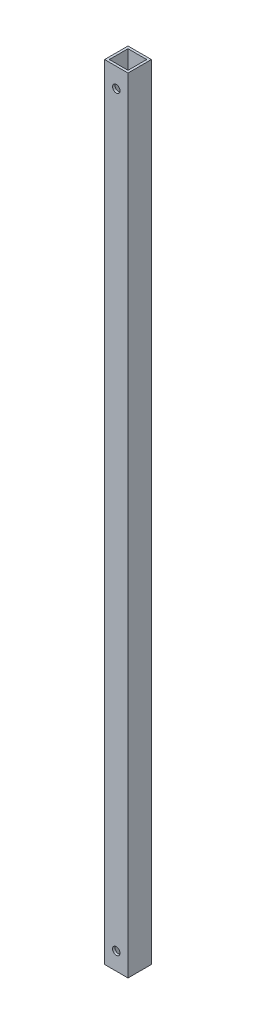
ISO-10303-21;
HEADER;
FILE_DESCRIPTION(('STEP AP214'),'2;1');
FILE_NAME('part.step','',(''),(''),'','','');
FILE_SCHEMA(('AUTOMOTIVE_DESIGN { 1 0 10303 214 1 1 1 1 }'));
ENDSEC;
DATA;
#1=APPLICATION_CONTEXT('core data for automotive mechanical design processes');
#2=APPLICATION_PROTOCOL_DEFINITION('international standard','automotive_design',2000,#1);
#3=PRODUCT_CONTEXT('',#1,'mechanical');
#4=PRODUCT('Part','Part','',(#3));
#5=PRODUCT_RELATED_PRODUCT_CATEGORY('part','',(#4));
#6=PRODUCT_DEFINITION_FORMATION('','',#4);
#7=PRODUCT_DEFINITION_CONTEXT('part definition',#1,'design');
#8=PRODUCT_DEFINITION('design','',#6,#7);
#9=PRODUCT_DEFINITION_SHAPE('','',#8);
#10=(LENGTH_UNIT() NAMED_UNIT(*) SI_UNIT(.MILLI.,.METRE.));
#11=(NAMED_UNIT(*) PLANE_ANGLE_UNIT() SI_UNIT($,.RADIAN.));
#12=(NAMED_UNIT(*) SI_UNIT($,.STERADIAN.) SOLID_ANGLE_UNIT());
#13=UNCERTAINTY_MEASURE_WITH_UNIT(LENGTH_MEASURE(1.E-05),#10,'distance_accuracy_value','');
#14=(GEOMETRIC_REPRESENTATION_CONTEXT(3) GLOBAL_UNCERTAINTY_ASSIGNED_CONTEXT((#13)) GLOBAL_UNIT_ASSIGNED_CONTEXT((#10,
#11,#12)) REPRESENTATION_CONTEXT('',''));
#15=CARTESIAN_POINT('',(0.,0.,0.));
#16=DIRECTION('',(0.,0.,1.));
#17=DIRECTION('',(1.,0.,0.));
#18=AXIS2_PLACEMENT_3D('',#15,#16,#17);
#19=CARTESIAN_POINT('',(5.00000000000012,326.683332908182,10.));
#20=DIRECTION('',(0.,0.,-1.));
#21=DIRECTION('',(-1.,0.,0.));
#22=AXIS2_PLACEMENT_3D('',#19,#20,#21);
#23=CYLINDRICAL_SURFACE('',#22,1.60000000000002);
#24=CARTESIAN_POINT('',(5.00000000000012,326.683332908182,9.));
#25=DIRECTION('',(0.,0.,1.));
#26=DIRECTION('',(1.,0.,0.));
#27=AXIS2_PLACEMENT_3D('',#24,#25,#26);
#28=CIRCLE('',#27,1.60000000000002);
#29=CARTESIAN_POINT('',(6.60000000000013,326.683332908182,9.));
#30=VERTEX_POINT('',#29);
#31=EDGE_CURVE('E136',#30,#30,#28,.T.);
#32=ORIENTED_EDGE('',*,*,#31,.F.);
#33=EDGE_LOOP('',(#32));
#34=FACE_BOUND('',#33,.T.);
#35=CARTESIAN_POINT('',(5.00000000000012,326.683332908182,10.));
#36=DIRECTION('',(0.,0.,1.));
#37=DIRECTION('',(1.,0.,0.));
#38=AXIS2_PLACEMENT_3D('',#35,#36,#37);
#39=CIRCLE('',#38,1.60000000000002);
#40=CARTESIAN_POINT('',(6.60000000000013,326.683332908182,10.));
#41=VERTEX_POINT('',#40);
#42=EDGE_CURVE('E153',#41,#41,#39,.T.);
#43=ORIENTED_EDGE('',*,*,#42,.T.);
#44=EDGE_LOOP('',(#43));
#45=FACE_BOUND('',#44,.T.);
#46=ADVANCED_FACE('F35',(#34,#45),#23,.F.);
#47=CARTESIAN_POINT('',(4.99999999999812,7.49999999999929,10.));
#48=DIRECTION('',(0.,0.,-1.));
#49=DIRECTION('',(-1.,0.,0.));
#50=AXIS2_PLACEMENT_3D('',#47,#48,#49);
#51=CYLINDRICAL_SURFACE('',#50,1.59999999999996);
#52=CARTESIAN_POINT('',(4.99999999999812,7.49999999999929,9.));
#53=DIRECTION('',(0.,0.,1.));
#54=DIRECTION('',(1.,0.,0.));
#55=AXIS2_PLACEMENT_3D('',#52,#53,#54);
#56=CIRCLE('',#55,1.59999999999996);
#57=CARTESIAN_POINT('',(6.59999999999808,7.49999999999929,9.));
#58=VERTEX_POINT('',#57);
#59=EDGE_CURVE('E39',#58,#58,#56,.T.);
#60=ORIENTED_EDGE('',*,*,#59,.F.);
#61=EDGE_LOOP('',(#60));
#62=FACE_BOUND('',#61,.T.);
#63=CARTESIAN_POINT('',(4.99999999999812,7.49999999999929,10.));
#64=DIRECTION('',(0.,0.,1.));
#65=DIRECTION('',(1.,0.,0.));
#66=AXIS2_PLACEMENT_3D('',#63,#64,#65);
#67=CIRCLE('',#66,1.59999999999996);
#68=CARTESIAN_POINT('',(6.59999999999808,7.49999999999929,10.));
#69=VERTEX_POINT('',#68);
#70=EDGE_CURVE('E147',#69,#69,#67,.T.);
#71=ORIENTED_EDGE('',*,*,#70,.T.);
#72=EDGE_LOOP('',(#71));
#73=FACE_BOUND('',#72,.T.);
#74=ADVANCED_FACE('F193',(#62,#73),#51,.F.);
#75=CARTESIAN_POINT('',(0.,0.,10.));
#76=DIRECTION('',(0.,0.,-1.));
#77=DIRECTION('',(-1.,0.,0.));
#78=AXIS2_PLACEMENT_3D('',#75,#76,#77);
#79=PLANE('',#78);
#80=DIRECTION('',(0.,1.,0.));
#81=VECTOR('',#80,1.);
#82=CARTESIAN_POINT('',(10.,335.,10.));
#83=LINE('',#82,#81);
#84=CARTESIAN_POINT('',(10.0000000000001,0.,10.));
#85=VERTEX_POINT('',#84);
#86=CARTESIAN_POINT('',(10.,335.,10.));
#87=VERTEX_POINT('',#86);
#88=EDGE_CURVE('E159',#85,#87,#83,.T.);
#89=ORIENTED_EDGE('',*,*,#88,.T.);
#90=DIRECTION('',(-1.,0.,0.));
#91=VECTOR('',#90,1.);
#92=CARTESIAN_POINT('',(0.,335.,10.));
#93=LINE('',#92,#91);
#94=CARTESIAN_POINT('',(0.,335.,10.));
#95=VERTEX_POINT('',#94);
#96=EDGE_CURVE('E162',#87,#95,#93,.T.);
#97=ORIENTED_EDGE('',*,*,#96,.T.);
#98=DIRECTION('',(0.,-1.,0.));
#99=VECTOR('',#98,1.);
#100=CARTESIAN_POINT('',(0.,0.,10.));
#101=LINE('',#100,#99);
#102=CARTESIAN_POINT('',(0.,0.,10.));
#103=VERTEX_POINT('',#102);
#104=EDGE_CURVE('E165',#95,#103,#101,.T.);
#105=ORIENTED_EDGE('',*,*,#104,.T.);
#106=DIRECTION('',(1.,0.,0.));
#107=VECTOR('',#106,1.);
#108=CARTESIAN_POINT('',(10.0000000000001,0.,10.));
#109=LINE('',#108,#107);
#110=EDGE_CURVE('E167',#103,#85,#109,.T.);
#111=ORIENTED_EDGE('',*,*,#110,.T.);
#112=EDGE_LOOP('',(#89,#97,#105,#111));
#113=FACE_BOUND('',#112,.T.);
#114=ORIENTED_EDGE('',*,*,#42,.F.);
#115=EDGE_LOOP('',(#114));
#116=FACE_BOUND('',#115,.T.);
#117=ORIENTED_EDGE('',*,*,#70,.F.);
#118=EDGE_LOOP('',(#117));
#119=FACE_BOUND('',#118,.T.);
#120=ADVANCED_FACE('F198',(#113,#116,#119),#79,.F.);
#121=CARTESIAN_POINT('',(0.,0.,0.));
#122=DIRECTION('',(0.,0.,-1.));
#123=DIRECTION('',(-1.,0.,0.));
#124=AXIS2_PLACEMENT_3D('',#121,#122,#123);
#125=PLANE('',#124);
#126=CARTESIAN_POINT('',(5.00000000000012,326.683332908182,0.));
#127=DIRECTION('',(0.,0.,1.));
#128=DIRECTION('',(1.,0.,0.));
#129=AXIS2_PLACEMENT_3D('',#126,#127,#128);
#130=CIRCLE('',#129,1.60000000000002);
#131=CARTESIAN_POINT('',(6.60000000000013,326.683332908182,0.));
#132=VERTEX_POINT('',#131);
#133=EDGE_CURVE('E150',#132,#132,#130,.T.);
#134=ORIENTED_EDGE('',*,*,#133,.T.);
#135=EDGE_LOOP('',(#134));
#136=FACE_BOUND('',#135,.T.);
#137=DIRECTION('',(0.,1.,0.));
#138=VECTOR('',#137,1.);
#139=CARTESIAN_POINT('',(10.,335.,0.));
#140=LINE('',#139,#138);
#141=CARTESIAN_POINT('',(10.0000000000001,0.,0.));
#142=VERTEX_POINT('',#141);
#143=CARTESIAN_POINT('',(10.,335.,0.));
#144=VERTEX_POINT('',#143);
#145=EDGE_CURVE('E156',#142,#144,#140,.T.);
#146=ORIENTED_EDGE('',*,*,#145,.F.);
#147=DIRECTION('',(1.,0.,0.));
#148=VECTOR('',#147,1.);
#149=CARTESIAN_POINT('',(10.0000000000001,0.,0.));
#150=LINE('',#149,#148);
#151=CARTESIAN_POINT('',(0.,0.,0.));
#152=VERTEX_POINT('',#151);
#153=EDGE_CURVE('E163',#152,#142,#150,.T.);
#154=ORIENTED_EDGE('',*,*,#153,.F.);
#155=DIRECTION('',(0.,-1.,0.));
#156=VECTOR('',#155,1.);
#157=CARTESIAN_POINT('',(0.,0.,0.));
#158=LINE('',#157,#156);
#159=CARTESIAN_POINT('',(0.,335.,0.));
#160=VERTEX_POINT('',#159);
#161=EDGE_CURVE('E174',#160,#152,#158,.T.);
#162=ORIENTED_EDGE('',*,*,#161,.F.);
#163=DIRECTION('',(-1.,0.,0.));
#164=VECTOR('',#163,1.);
#165=CARTESIAN_POINT('',(0.,335.,0.));
#166=LINE('',#165,#164);
#167=EDGE_CURVE('E172',#144,#160,#166,.T.);
#168=ORIENTED_EDGE('',*,*,#167,.F.);
#169=EDGE_LOOP('',(#146,#154,#162,#168));
#170=FACE_BOUND('',#169,.T.);
#171=CARTESIAN_POINT('',(4.99999999999812,7.49999999999929,0.));
#172=DIRECTION('',(0.,0.,1.));
#173=DIRECTION('',(1.,0.,0.));
#174=AXIS2_PLACEMENT_3D('',#171,#172,#173);
#175=CIRCLE('',#174,1.59999999999996);
#176=CARTESIAN_POINT('',(6.59999999999808,7.49999999999929,0.));
#177=VERTEX_POINT('',#176);
#178=EDGE_CURVE('E146',#177,#177,#175,.T.);
#179=ORIENTED_EDGE('',*,*,#178,.T.);
#180=EDGE_LOOP('',(#179));
#181=FACE_BOUND('',#180,.T.);
#182=ADVANCED_FACE('F196',(#136,#170,#181),#125,.T.);
#183=CARTESIAN_POINT('',(10.,335.,10.));
#184=DIRECTION('',(-1.,0.,0.));
#185=DIRECTION('',(0.,-1.,0.));
#186=AXIS2_PLACEMENT_3D('',#183,#184,#185);
#187=PLANE('',#186);
#188=ORIENTED_EDGE('',*,*,#145,.T.);
#189=DIRECTION('',(0.,0.,-1.));
#190=VECTOR('',#189,1.);
#191=CARTESIAN_POINT('',(10.,335.,10.));
#192=LINE('',#191,#190);
#193=EDGE_CURVE('E11',#87,#144,#192,.T.);
#194=ORIENTED_EDGE('',*,*,#193,.F.);
#195=ORIENTED_EDGE('',*,*,#88,.F.);
#196=DIRECTION('',(0.,0.,-1.));
#197=VECTOR('',#196,1.);
#198=CARTESIAN_POINT('',(10.0000000000001,0.,10.));
#199=LINE('',#198,#197);
#200=EDGE_CURVE('E169',#85,#142,#199,.T.);
#201=ORIENTED_EDGE('',*,*,#200,.T.);
#202=EDGE_LOOP('',(#188,#194,#195,#201));
#203=FACE_BOUND('',#202,.T.);
#204=ADVANCED_FACE('F37',(#203),#187,.F.);
#205=CARTESIAN_POINT('',(0.,335.,10.));
#206=DIRECTION('',(0.,-1.,0.));
#207=DIRECTION('',(0.,0.,-1.));
#208=AXIS2_PLACEMENT_3D('',#205,#206,#207);
#209=PLANE('',#208);
#210=DIRECTION('',(-1.,0.,0.));
#211=VECTOR('',#210,1.);
#212=CARTESIAN_POINT('',(0.,335.,9.));
#213=LINE('',#212,#211);
#214=CARTESIAN_POINT('',(9.00000000000006,335.,9.));
#215=VERTEX_POINT('',#214);
#216=CARTESIAN_POINT('',(1.,335.,9.));
#217=VERTEX_POINT('',#216);
#218=EDGE_CURVE('E139',#215,#217,#213,.T.);
#219=ORIENTED_EDGE('',*,*,#218,.T.);
#220=DIRECTION('',(0.,0.,-1.));
#221=VECTOR('',#220,1.);
#222=CARTESIAN_POINT('',(1.,335.,10.));
#223=LINE('',#222,#221);
#224=CARTESIAN_POINT('',(1.,335.,1.));
#225=VERTEX_POINT('',#224);
#226=EDGE_CURVE('E143',#217,#225,#223,.T.);
#227=ORIENTED_EDGE('',*,*,#226,.T.);
#228=DIRECTION('',(1.,0.,0.));
#229=VECTOR('',#228,1.);
#230=CARTESIAN_POINT('',(0.,335.,0.999999999999999));
#231=LINE('',#230,#229);
#232=CARTESIAN_POINT('',(9.00000000000006,335.,0.999999999999999));
#233=VERTEX_POINT('',#232);
#234=EDGE_CURVE('E134',#225,#233,#231,.T.);
#235=ORIENTED_EDGE('',*,*,#234,.T.);
#236=DIRECTION('',(0.,0.,1.));
#237=VECTOR('',#236,1.);
#238=CARTESIAN_POINT('',(9.00000000000006,335.,10.));
#239=LINE('',#238,#237);
#240=EDGE_CURVE('E108',#233,#215,#239,.T.);
#241=ORIENTED_EDGE('',*,*,#240,.T.);
#242=EDGE_LOOP('',(#219,#227,#235,#241));
#243=FACE_BOUND('',#242,.T.);
#244=ORIENTED_EDGE('',*,*,#167,.T.);
#245=DIRECTION('',(0.,0.,-1.));
#246=VECTOR('',#245,1.);
#247=CARTESIAN_POINT('',(0.,335.,10.));
#248=LINE('',#247,#246);
#249=EDGE_CURVE('E44',#95,#160,#248,.T.);
#250=ORIENTED_EDGE('',*,*,#249,.F.);
#251=ORIENTED_EDGE('',*,*,#96,.F.);
#252=ORIENTED_EDGE('',*,*,#193,.T.);
#253=EDGE_LOOP('',(#244,#250,#251,#252));
#254=FACE_BOUND('',#253,.T.);
#255=ADVANCED_FACE('F205',(#243,#254),#209,.F.);
#256=CARTESIAN_POINT('',(0.,0.,10.));
#257=DIRECTION('',(1.,0.,0.));
#258=DIRECTION('',(0.,0.,-1.));
#259=AXIS2_PLACEMENT_3D('',#256,#257,#258);
#260=PLANE('',#259);
#261=ORIENTED_EDGE('',*,*,#161,.T.);
#262=DIRECTION('',(0.,0.,-1.));
#263=VECTOR('',#262,1.);
#264=CARTESIAN_POINT('',(0.,0.,10.));
#265=LINE('',#264,#263);
#266=EDGE_CURVE('E179',#103,#152,#265,.T.);
#267=ORIENTED_EDGE('',*,*,#266,.F.);
#268=ORIENTED_EDGE('',*,*,#104,.F.);
#269=ORIENTED_EDGE('',*,*,#249,.T.);
#270=EDGE_LOOP('',(#261,#267,#268,#269));
#271=FACE_BOUND('',#270,.T.);
#272=ADVANCED_FACE('F226',(#271),#260,.F.);
#273=CARTESIAN_POINT('',(10.0000000000001,0.,10.));
#274=DIRECTION('',(0.,1.,0.));
#275=DIRECTION('',(0.,0.,1.));
#276=AXIS2_PLACEMENT_3D('',#273,#274,#275);
#277=PLANE('',#276);
#278=DIRECTION('',(1.,0.,0.));
#279=VECTOR('',#278,1.);
#280=CARTESIAN_POINT('',(1.,0.,1.));
#281=LINE('',#280,#279);
#282=CARTESIAN_POINT('',(0.999999999999999,0.,0.999999999999999));
#283=VERTEX_POINT('',#282);
#284=CARTESIAN_POINT('',(9.00000000000006,0.,1.));
#285=VERTEX_POINT('',#284);
#286=EDGE_CURVE('E114',#283,#285,#281,.T.);
#287=ORIENTED_EDGE('',*,*,#286,.F.);
#288=DIRECTION('',(0.,0.,-1.));
#289=VECTOR('',#288,1.);
#290=CARTESIAN_POINT('',(1.,0.,9.));
#291=LINE('',#290,#289);
#292=CARTESIAN_POINT('',(1.,0.,9.));
#293=VERTEX_POINT('',#292);
#294=EDGE_CURVE('E60',#293,#283,#291,.T.);
#295=ORIENTED_EDGE('',*,*,#294,.F.);
#296=DIRECTION('',(-1.,0.,0.));
#297=VECTOR('',#296,1.);
#298=CARTESIAN_POINT('',(9.00000000000006,0.,9.));
#299=LINE('',#298,#297);
#300=CARTESIAN_POINT('',(9.00000000000006,0.,9.));
#301=VERTEX_POINT('',#300);
#302=EDGE_CURVE('E121',#301,#293,#299,.T.);
#303=ORIENTED_EDGE('',*,*,#302,.F.);
#304=DIRECTION('',(0.,0.,1.));
#305=VECTOR('',#304,1.);
#306=CARTESIAN_POINT('',(9.00000000000006,0.,1.));
#307=LINE('',#306,#305);
#308=EDGE_CURVE('E105',#285,#301,#307,.T.);
#309=ORIENTED_EDGE('',*,*,#308,.F.);
#310=EDGE_LOOP('',(#287,#295,#303,#309));
#311=FACE_BOUND('',#310,.T.);
#312=ORIENTED_EDGE('',*,*,#153,.T.);
#313=ORIENTED_EDGE('',*,*,#200,.F.);
#314=ORIENTED_EDGE('',*,*,#110,.F.);
#315=ORIENTED_EDGE('',*,*,#266,.T.);
#316=EDGE_LOOP('',(#312,#313,#314,#315));
#317=FACE_BOUND('',#316,.T.);
#318=ADVANCED_FACE('F118',(#311,#317),#277,.F.);
#319=CARTESIAN_POINT('',(5.00000000000012,326.683332908182,0.999999999999999));
#320=DIRECTION('',(0.,0.,-1.));
#321=DIRECTION('',(-1.,0.,0.));
#322=AXIS2_PLACEMENT_3D('',#319,#320,#321);
#323=CIRCLE('',#322,1.60000000000002);
#324=CARTESIAN_POINT('',(3.4000000000001,326.683332908182,0.999999999999999));
#325=VERTEX_POINT('',#324);
#326=EDGE_CURVE('E131',#325,#325,#323,.T.);
#327=ORIENTED_EDGE('',*,*,#326,.F.);
#328=EDGE_LOOP('',(#327));
#329=FACE_BOUND('',#328,.T.);
#330=ORIENTED_EDGE('',*,*,#133,.F.);
#331=EDGE_LOOP('',(#330));
#332=FACE_BOUND('',#331,.T.);
#333=ADVANCED_FACE('F191',(#329,#332),#23,.F.);
#334=CARTESIAN_POINT('',(4.99999999999812,7.49999999999929,0.999999999999999));
#335=DIRECTION('',(0.,0.,-1.));
#336=DIRECTION('',(-1.,0.,0.));
#337=AXIS2_PLACEMENT_3D('',#334,#335,#336);
#338=CIRCLE('',#337,1.59999999999996);
#339=CARTESIAN_POINT('',(3.39999999999815,7.49999999999929,0.999999999999999));
#340=VERTEX_POINT('',#339);
#341=EDGE_CURVE('E128',#340,#340,#338,.T.);
#342=ORIENTED_EDGE('',*,*,#341,.F.);
#343=EDGE_LOOP('',(#342));
#344=FACE_BOUND('',#343,.T.);
#345=ORIENTED_EDGE('',*,*,#178,.F.);
#346=EDGE_LOOP('',(#345));
#347=FACE_BOUND('',#346,.T.);
#348=ADVANCED_FACE('F187',(#344,#347),#51,.F.);
#349=CARTESIAN_POINT('',(1.,1000.,9.));
#350=DIRECTION('',(-1.,0.,0.));
#351=DIRECTION('',(0.,0.,1.));
#352=AXIS2_PLACEMENT_3D('',#349,#350,#351);
#353=PLANE('',#352);
#354=DIRECTION('',(0.,-1.,0.));
#355=VECTOR('',#354,1.);
#356=CARTESIAN_POINT('',(1.,1000.,9.));
#357=LINE('',#356,#355);
#358=EDGE_CURVE('E126',#217,#293,#357,.T.);
#359=ORIENTED_EDGE('',*,*,#358,.T.);
#360=ORIENTED_EDGE('',*,*,#294,.T.);
#361=DIRECTION('',(0.,-1.,0.));
#362=VECTOR('',#361,1.);
#363=CARTESIAN_POINT('',(1.,1000.,1.));
#364=LINE('',#363,#362);
#365=EDGE_CURVE('E111',#225,#283,#364,.T.);
#366=ORIENTED_EDGE('',*,*,#365,.F.);
#367=ORIENTED_EDGE('',*,*,#226,.F.);
#368=EDGE_LOOP('',(#359,#360,#366,#367));
#369=FACE_BOUND('',#368,.T.);
#370=ADVANCED_FACE('F190',(#369),#353,.F.);
#371=CARTESIAN_POINT('',(9.00000000000006,1000.,1.));
#372=DIRECTION('',(1.,0.,0.));
#373=DIRECTION('',(0.,0.,-1.));
#374=AXIS2_PLACEMENT_3D('',#371,#372,#373);
#375=PLANE('',#374);
#376=DIRECTION('',(0.,-1.,0.));
#377=VECTOR('',#376,1.);
#378=CARTESIAN_POINT('',(9.00000000000006,1000.,1.));
#379=LINE('',#378,#377);
#380=EDGE_CURVE('E52',#233,#285,#379,.T.);
#381=ORIENTED_EDGE('',*,*,#380,.T.);
#382=ORIENTED_EDGE('',*,*,#308,.T.);
#383=DIRECTION('',(0.,-1.,0.));
#384=VECTOR('',#383,1.);
#385=CARTESIAN_POINT('',(9.00000000000006,1000.,9.));
#386=LINE('',#385,#384);
#387=EDGE_CURVE('E110',#215,#301,#386,.T.);
#388=ORIENTED_EDGE('',*,*,#387,.F.);
#389=ORIENTED_EDGE('',*,*,#240,.F.);
#390=EDGE_LOOP('',(#381,#382,#388,#389));
#391=FACE_BOUND('',#390,.T.);
#392=ADVANCED_FACE('F102',(#391),#375,.F.);
#393=CARTESIAN_POINT('',(9.00000000000006,1000.,9.));
#394=DIRECTION('',(0.,0.,1.));
#395=DIRECTION('',(1.,0.,0.));
#396=AXIS2_PLACEMENT_3D('',#393,#394,#395);
#397=PLANE('',#396);
#398=ORIENTED_EDGE('',*,*,#31,.T.);
#399=EDGE_LOOP('',(#398));
#400=FACE_BOUND('',#399,.T.);
#401=ORIENTED_EDGE('',*,*,#59,.T.);
#402=EDGE_LOOP('',(#401));
#403=FACE_BOUND('',#402,.T.);
#404=ORIENTED_EDGE('',*,*,#387,.T.);
#405=ORIENTED_EDGE('',*,*,#302,.T.);
#406=ORIENTED_EDGE('',*,*,#358,.F.);
#407=ORIENTED_EDGE('',*,*,#218,.F.);
#408=EDGE_LOOP('',(#404,#405,#406,#407));
#409=FACE_BOUND('',#408,.T.);
#410=ADVANCED_FACE('F232',(#400,#403,#409),#397,.F.);
#411=CARTESIAN_POINT('',(1.,1000.,1.));
#412=DIRECTION('',(0.,0.,-1.));
#413=DIRECTION('',(-1.,0.,0.));
#414=AXIS2_PLACEMENT_3D('',#411,#412,#413);
#415=PLANE('',#414);
#416=ORIENTED_EDGE('',*,*,#326,.T.);
#417=EDGE_LOOP('',(#416));
#418=FACE_BOUND('',#417,.T.);
#419=ORIENTED_EDGE('',*,*,#341,.T.);
#420=EDGE_LOOP('',(#419));
#421=FACE_BOUND('',#420,.T.);
#422=ORIENTED_EDGE('',*,*,#365,.T.);
#423=ORIENTED_EDGE('',*,*,#286,.T.);
#424=ORIENTED_EDGE('',*,*,#380,.F.);
#425=ORIENTED_EDGE('',*,*,#234,.F.);
#426=EDGE_LOOP('',(#422,#423,#424,#425));
#427=FACE_BOUND('',#426,.T.);
#428=ADVANCED_FACE('F115',(#418,#421,#427),#415,.F.);
#429=CLOSED_SHELL('',(#46,#74,#120,#182,#204,#255,#272,#318,#333,#348,#370,#392,#410,#428));
#430=MANIFOLD_SOLID_BREP('B2',#429);
#431=ADVANCED_BREP_SHAPE_REPRESENTATION('',(#18,#430),#14);
#432=SHAPE_DEFINITION_REPRESENTATION(#9,#431);
ENDSEC;
END-ISO-10303-21;
